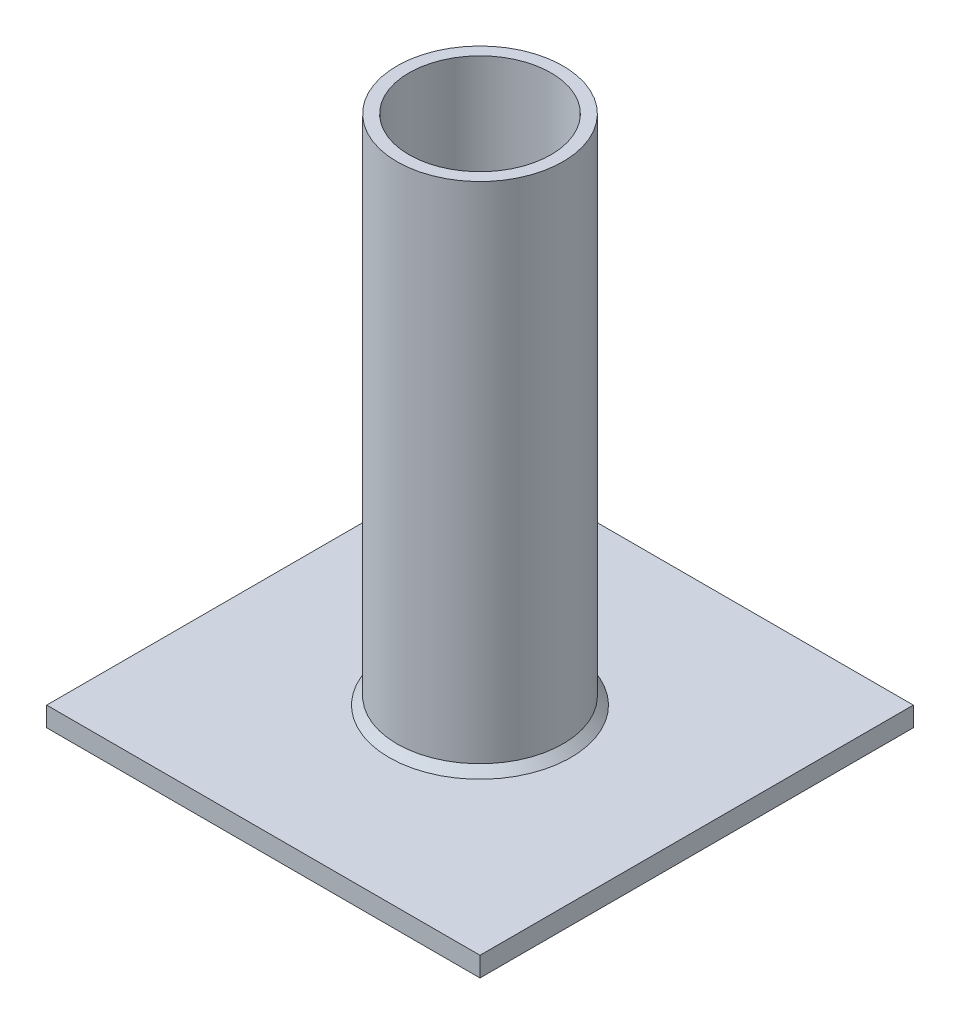
ISO-10303-21;
HEADER;
FILE_DESCRIPTION(('STEP AP214'),'2;1');
FILE_NAME('part.step','',(''),(''),'','','');
FILE_SCHEMA(('AUTOMOTIVE_DESIGN { 1 0 10303 214 1 1 1 1 }'));
ENDSEC;
DATA;
#1=APPLICATION_CONTEXT('core data for automotive mechanical design processes');
#2=APPLICATION_PROTOCOL_DEFINITION('international standard','automotive_design',2000,#1);
#3=PRODUCT_CONTEXT('',#1,'mechanical');
#4=PRODUCT('Part','Part','',(#3));
#5=PRODUCT_RELATED_PRODUCT_CATEGORY('part','',(#4));
#6=PRODUCT_DEFINITION_FORMATION('','',#4);
#7=PRODUCT_DEFINITION_CONTEXT('part definition',#1,'design');
#8=PRODUCT_DEFINITION('design','',#6,#7);
#9=PRODUCT_DEFINITION_SHAPE('','',#8);
#10=(LENGTH_UNIT() NAMED_UNIT(*) SI_UNIT(.MILLI.,.METRE.));
#11=(NAMED_UNIT(*) PLANE_ANGLE_UNIT() SI_UNIT($,.RADIAN.));
#12=(NAMED_UNIT(*) SI_UNIT($,.STERADIAN.) SOLID_ANGLE_UNIT());
#13=UNCERTAINTY_MEASURE_WITH_UNIT(LENGTH_MEASURE(1.E-05),#10,'distance_accuracy_value','');
#14=(GEOMETRIC_REPRESENTATION_CONTEXT(3) GLOBAL_UNCERTAINTY_ASSIGNED_CONTEXT((#13)) GLOBAL_UNIT_ASSIGNED_CONTEXT((#10,
#11,#12)) REPRESENTATION_CONTEXT('',''));
#15=CARTESIAN_POINT('',(0.,0.,0.));
#16=DIRECTION('',(0.,0.,1.));
#17=DIRECTION('',(1.,0.,0.));
#18=AXIS2_PLACEMENT_3D('',#15,#16,#17);
#19=CARTESIAN_POINT('',(0.,5.,0.));
#20=DIRECTION('',(0.,1.,0.));
#21=DIRECTION('',(0.,0.,1.));
#22=AXIS2_PLACEMENT_3D('',#19,#20,#21);
#23=PLANE('',#22);
#24=CARTESIAN_POINT('',(0.,5.,0.));
#25=DIRECTION('',(0.,1.,0.));
#26=DIRECTION('',(0.,0.,1.));
#27=AXIS2_PLACEMENT_3D('',#24,#25,#26);
#28=CIRCLE('',#27,23.0749999999999);
#29=CARTESIAN_POINT('',(0.,5.,23.0749999999999));
#30=VERTEX_POINT('',#29);
#31=EDGE_CURVE('E11',#30,#30,#28,.F.);
#32=ORIENTED_EDGE('',*,*,#31,.T.);
#33=EDGE_LOOP('',(#32));
#34=FACE_BOUND('',#33,.T.);
#35=DIRECTION('',(0.,0.,-1.));
#36=VECTOR('',#35,1.);
#37=CARTESIAN_POINT('',(55.,5.,-55.));
#38=LINE('',#37,#36);
#39=CARTESIAN_POINT('',(55.,5.,55.));
#40=VERTEX_POINT('',#39);
#41=CARTESIAN_POINT('',(55.,5.,-55.));
#42=VERTEX_POINT('',#41);
#43=EDGE_CURVE('E86',#40,#42,#38,.T.);
#44=ORIENTED_EDGE('',*,*,#43,.T.);
#45=DIRECTION('',(-1.,0.,0.));
#46=VECTOR('',#45,1.);
#47=CARTESIAN_POINT('',(-55.,5.,-55.));
#48=LINE('',#47,#46);
#49=CARTESIAN_POINT('',(-55.,5.,-55.));
#50=VERTEX_POINT('',#49);
#51=EDGE_CURVE('E82',#42,#50,#48,.T.);
#52=ORIENTED_EDGE('',*,*,#51,.T.);
#53=DIRECTION('',(0.,0.,1.));
#54=VECTOR('',#53,1.);
#55=CARTESIAN_POINT('',(-55.,5.,-55.));
#56=LINE('',#55,#54);
#57=CARTESIAN_POINT('',(-55.,5.,55.));
#58=VERTEX_POINT('',#57);
#59=EDGE_CURVE('E84',#50,#58,#56,.T.);
#60=ORIENTED_EDGE('',*,*,#59,.T.);
#61=DIRECTION('',(1.,0.,0.));
#62=VECTOR('',#61,1.);
#63=CARTESIAN_POINT('',(-55.,5.,55.));
#64=LINE('',#63,#62);
#65=EDGE_CURVE('E51',#58,#40,#64,.T.);
#66=ORIENTED_EDGE('',*,*,#65,.T.);
#67=EDGE_LOOP('',(#44,#52,#60,#66));
#68=FACE_BOUND('',#67,.T.);
#69=ADVANCED_FACE('F34',(#34,#68),#23,.T.);
#70=CARTESIAN_POINT('',(55.,5.,-55.));
#71=DIRECTION('',(-1.,0.,0.));
#72=DIRECTION('',(0.,0.,1.));
#73=AXIS2_PLACEMENT_3D('',#70,#71,#72);
#74=PLANE('',#73);
#75=DIRECTION('',(0.,0.,-1.));
#76=VECTOR('',#75,1.);
#77=CARTESIAN_POINT('',(55.,0.,-55.));
#78=LINE('',#77,#76);
#79=CARTESIAN_POINT('',(55.,0.,55.));
#80=VERTEX_POINT('',#79);
#81=CARTESIAN_POINT('',(55.,0.,-55.));
#82=VERTEX_POINT('',#81);
#83=EDGE_CURVE('E101',#80,#82,#78,.T.);
#84=ORIENTED_EDGE('',*,*,#83,.T.);
#85=DIRECTION('',(0.,-1.,0.));
#86=VECTOR('',#85,1.);
#87=CARTESIAN_POINT('',(55.,5.,-55.));
#88=LINE('',#87,#86);
#89=EDGE_CURVE('E92',#42,#82,#88,.T.);
#90=ORIENTED_EDGE('',*,*,#89,.F.);
#91=ORIENTED_EDGE('',*,*,#43,.F.);
#92=DIRECTION('',(0.,-1.,0.));
#93=VECTOR('',#92,1.);
#94=CARTESIAN_POINT('',(55.,5.,55.));
#95=LINE('',#94,#93);
#96=EDGE_CURVE('E97',#40,#80,#95,.T.);
#97=ORIENTED_EDGE('',*,*,#96,.T.);
#98=EDGE_LOOP('',(#84,#90,#91,#97));
#99=FACE_BOUND('',#98,.T.);
#100=ADVANCED_FACE('F130',(#99),#74,.F.);
#101=CARTESIAN_POINT('',(-55.,5.,-55.));
#102=DIRECTION('',(0.,0.,1.));
#103=DIRECTION('',(1.,0.,0.));
#104=AXIS2_PLACEMENT_3D('',#101,#102,#103);
#105=PLANE('',#104);
#106=DIRECTION('',(-1.,0.,0.));
#107=VECTOR('',#106,1.);
#108=CARTESIAN_POINT('',(-55.,0.,-55.));
#109=LINE('',#108,#107);
#110=CARTESIAN_POINT('',(-55.,0.,-55.));
#111=VERTEX_POINT('',#110);
#112=EDGE_CURVE('E91',#82,#111,#109,.T.);
#113=ORIENTED_EDGE('',*,*,#112,.T.);
#114=DIRECTION('',(0.,-1.,0.));
#115=VECTOR('',#114,1.);
#116=CARTESIAN_POINT('',(-55.,5.,-55.));
#117=LINE('',#116,#115);
#118=EDGE_CURVE('E89',#50,#111,#117,.T.);
#119=ORIENTED_EDGE('',*,*,#118,.F.);
#120=ORIENTED_EDGE('',*,*,#51,.F.);
#121=ORIENTED_EDGE('',*,*,#89,.T.);
#122=EDGE_LOOP('',(#113,#119,#120,#121));
#123=FACE_BOUND('',#122,.T.);
#124=ADVANCED_FACE('F90',(#123),#105,.F.);
#125=CARTESIAN_POINT('',(-55.,5.,-55.));
#126=DIRECTION('',(1.,0.,0.));
#127=DIRECTION('',(0.,0.,-1.));
#128=AXIS2_PLACEMENT_3D('',#125,#126,#127);
#129=PLANE('',#128);
#130=DIRECTION('',(0.,0.,1.));
#131=VECTOR('',#130,1.);
#132=CARTESIAN_POINT('',(-55.,0.,-55.));
#133=LINE('',#132,#131);
#134=CARTESIAN_POINT('',(-55.,0.,55.));
#135=VERTEX_POINT('',#134);
#136=EDGE_CURVE('E68',#111,#135,#133,.T.);
#137=ORIENTED_EDGE('',*,*,#136,.T.);
#138=DIRECTION('',(0.,-1.,0.));
#139=VECTOR('',#138,1.);
#140=CARTESIAN_POINT('',(-55.,5.,55.));
#141=LINE('',#140,#139);
#142=EDGE_CURVE('E93',#58,#135,#141,.T.);
#143=ORIENTED_EDGE('',*,*,#142,.F.);
#144=ORIENTED_EDGE('',*,*,#59,.F.);
#145=ORIENTED_EDGE('',*,*,#118,.T.);
#146=EDGE_LOOP('',(#137,#143,#144,#145));
#147=FACE_BOUND('',#146,.T.);
#148=ADVANCED_FACE('F95',(#147),#129,.F.);
#149=CARTESIAN_POINT('',(-55.,5.,55.));
#150=DIRECTION('',(0.,0.,-1.));
#151=DIRECTION('',(-1.,0.,0.));
#152=AXIS2_PLACEMENT_3D('',#149,#150,#151);
#153=PLANE('',#152);
#154=DIRECTION('',(1.,0.,0.));
#155=VECTOR('',#154,1.);
#156=CARTESIAN_POINT('',(-55.,0.,55.));
#157=LINE('',#156,#155);
#158=EDGE_CURVE('E74',#135,#80,#157,.T.);
#159=ORIENTED_EDGE('',*,*,#158,.T.);
#160=ORIENTED_EDGE('',*,*,#96,.F.);
#161=ORIENTED_EDGE('',*,*,#65,.F.);
#162=ORIENTED_EDGE('',*,*,#142,.T.);
#163=EDGE_LOOP('',(#159,#160,#161,#162));
#164=FACE_BOUND('',#163,.T.);
#165=ADVANCED_FACE('F143',(#164),#153,.F.);
#166=CARTESIAN_POINT('',(0.,0.,0.));
#167=DIRECTION('',(0.,1.,0.));
#168=DIRECTION('',(0.,0.,1.));
#169=AXIS2_PLACEMENT_3D('',#166,#167,#168);
#170=PLANE('',#169);
#171=ORIENTED_EDGE('',*,*,#83,.F.);
#172=ORIENTED_EDGE('',*,*,#158,.F.);
#173=ORIENTED_EDGE('',*,*,#136,.F.);
#174=ORIENTED_EDGE('',*,*,#112,.F.);
#175=EDGE_LOOP('',(#171,#172,#173,#174));
#176=FACE_BOUND('',#175,.T.);
#177=ADVANCED_FACE('F139',(#176),#170,.F.);
#178=CARTESIAN_POINT('',(0.,135.,0.));
#179=DIRECTION('',(0.,1.,0.));
#180=DIRECTION('',(0.,0.,1.));
#181=AXIS2_PLACEMENT_3D('',#178,#179,#180);
#182=PLANE('',#181);
#183=CARTESIAN_POINT('',(0.,135.,0.));
#184=DIRECTION('',(0.,1.,0.));
#185=DIRECTION('',(0.,0.,1.));
#186=AXIS2_PLACEMENT_3D('',#183,#184,#185);
#187=CIRCLE('',#186,21.075);
#188=CARTESIAN_POINT('',(0.,135.,21.075));
#189=VERTEX_POINT('',#188);
#190=EDGE_CURVE('E104',#189,#189,#187,.T.);
#191=ORIENTED_EDGE('',*,*,#190,.T.);
#192=EDGE_LOOP('',(#191));
#193=FACE_BOUND('',#192,.T.);
#194=CARTESIAN_POINT('',(0.,135.,0.));
#195=DIRECTION('',(0.,1.,0.));
#196=DIRECTION('',(0.,0.,1.));
#197=AXIS2_PLACEMENT_3D('',#194,#195,#196);
#198=CIRCLE('',#197,18.025);
#199=CARTESIAN_POINT('',(0.,135.,18.025));
#200=VERTEX_POINT('',#199);
#201=EDGE_CURVE('E221',#200,#200,#198,.T.);
#202=ORIENTED_EDGE('',*,*,#201,.F.);
#203=EDGE_LOOP('',(#202));
#204=FACE_BOUND('',#203,.T.);
#205=ADVANCED_FACE('F142',(#193,#204),#182,.T.);
#206=CARTESIAN_POINT('',(0.,135.,0.));
#207=DIRECTION('',(0.,-1.,0.));
#208=DIRECTION('',(0.,0.,-1.));
#209=AXIS2_PLACEMENT_3D('',#206,#207,#208);
#210=CYLINDRICAL_SURFACE('',#209,21.075);
#211=CARTESIAN_POINT('',(0.,6.99999999999992,0.));
#212=DIRECTION('',(0.,1.,0.));
#213=DIRECTION('',(0.,0.,1.));
#214=AXIS2_PLACEMENT_3D('',#211,#212,#213);
#215=CIRCLE('',#214,21.075);
#216=CARTESIAN_POINT('',(0.,6.99999999999992,21.075));
#217=VERTEX_POINT('',#216);
#218=EDGE_CURVE('E43',#217,#217,#215,.T.);
#219=ORIENTED_EDGE('',*,*,#218,.T.);
#220=EDGE_LOOP('',(#219));
#221=FACE_BOUND('',#220,.T.);
#222=ORIENTED_EDGE('',*,*,#190,.F.);
#223=EDGE_LOOP('',(#222));
#224=FACE_BOUND('',#223,.T.);
#225=ADVANCED_FACE('F116',(#221,#224),#210,.T.);
#226=CARTESIAN_POINT('',(0.,135.,0.));
#227=DIRECTION('',(0.,-1.,0.));
#228=DIRECTION('',(0.,0.,-1.));
#229=AXIS2_PLACEMENT_3D('',#226,#227,#228);
#230=CYLINDRICAL_SURFACE('',#229,18.025);
#231=ORIENTED_EDGE('',*,*,#201,.T.);
#232=EDGE_LOOP('',(#231));
#233=FACE_BOUND('',#232,.T.);
#234=CARTESIAN_POINT('',(0.,5.,0.));
#235=DIRECTION('',(0.,1.,0.));
#236=DIRECTION('',(0.,0.,1.));
#237=AXIS2_PLACEMENT_3D('',#234,#235,#236);
#238=CIRCLE('',#237,18.025);
#239=CARTESIAN_POINT('',(0.,5.,18.025));
#240=VERTEX_POINT('',#239);
#241=EDGE_CURVE('E111',#240,#240,#238,.F.);
#242=ORIENTED_EDGE('',*,*,#241,.T.);
#243=EDGE_LOOP('',(#242));
#244=FACE_BOUND('',#243,.T.);
#245=ADVANCED_FACE('F125',(#233,#244),#230,.F.);
#246=ORIENTED_EDGE('',*,*,#241,.F.);
#247=EDGE_LOOP('',(#246));
#248=FACE_BOUND('',#247,.T.);
#249=ADVANCED_FACE('F120',(#248),#23,.T.);
#250=CARTESIAN_POINT('',(0.,6.99999999999992,0.));
#251=DIRECTION('',(0.,-1.,0.));
#252=DIRECTION('',(0.,0.,-1.));
#253=AXIS2_PLACEMENT_3D('',#250,#251,#252);
#254=CONICAL_SURFACE('',#253,21.075,0.785398163397451);
#255=ORIENTED_EDGE('',*,*,#31,.F.);
#256=EDGE_LOOP('',(#255));
#257=FACE_BOUND('',#256,.T.);
#258=ORIENTED_EDGE('',*,*,#218,.F.);
#259=EDGE_LOOP('',(#258));
#260=FACE_BOUND('',#259,.T.);
#261=ADVANCED_FACE('F36',(#257,#260),#254,.T.);
#262=CLOSED_SHELL('',(#69,#100,#124,#148,#165,#177,#205,#225,#245,#249,#261));
#263=MANIFOLD_SOLID_BREP('B2',#262);
#264=ADVANCED_BREP_SHAPE_REPRESENTATION('',(#18,#263),#14);
#265=SHAPE_DEFINITION_REPRESENTATION(#9,#264);
ENDSEC;
END-ISO-10303-21;
